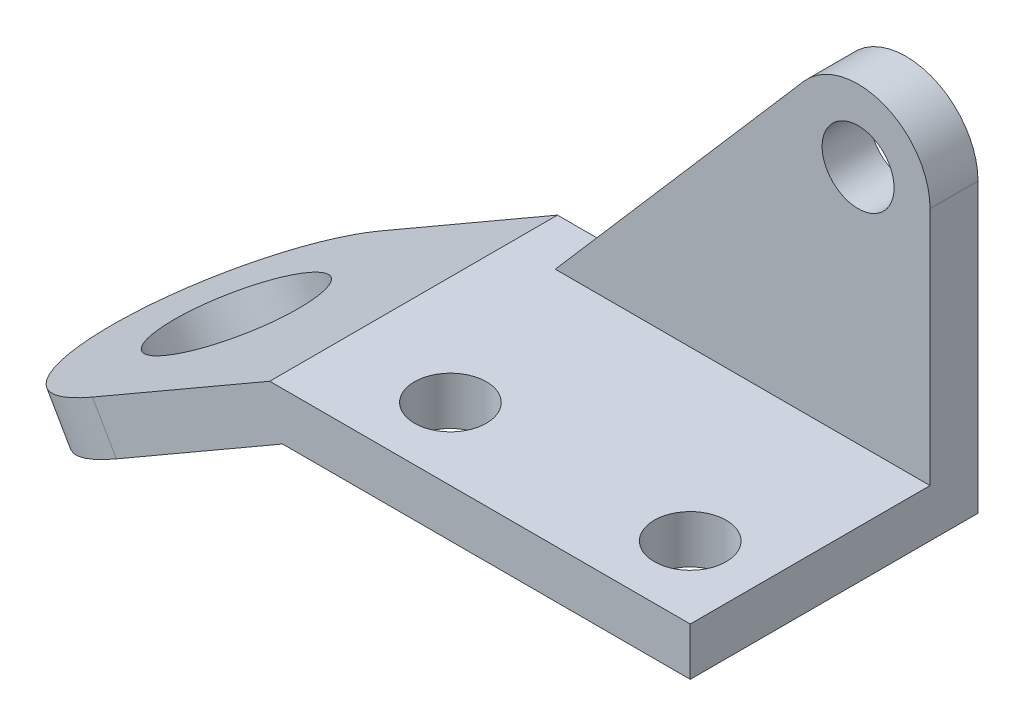
ISO-10303-21;
HEADER;
FILE_DESCRIPTION(('STEP AP214'),'2;1');
FILE_NAME('part.step','',(''),(''),'','','');
FILE_SCHEMA(('AUTOMOTIVE_DESIGN { 1 0 10303 214 1 1 1 1 }'));
ENDSEC;
DATA;
#1=APPLICATION_CONTEXT('core data for automotive mechanical design processes');
#2=APPLICATION_PROTOCOL_DEFINITION('international standard','automotive_design',2000,#1);
#3=PRODUCT_CONTEXT('',#1,'mechanical');
#4=PRODUCT('Part','Part','',(#3));
#5=PRODUCT_RELATED_PRODUCT_CATEGORY('part','',(#4));
#6=PRODUCT_DEFINITION_FORMATION('','',#4);
#7=PRODUCT_DEFINITION_CONTEXT('part definition',#1,'design');
#8=PRODUCT_DEFINITION('design','',#6,#7);
#9=PRODUCT_DEFINITION_SHAPE('','',#8);
#10=(LENGTH_UNIT() NAMED_UNIT(*) SI_UNIT(.MILLI.,.METRE.));
#11=(NAMED_UNIT(*) PLANE_ANGLE_UNIT() SI_UNIT($,.RADIAN.));
#12=(NAMED_UNIT(*) SI_UNIT($,.STERADIAN.) SOLID_ANGLE_UNIT());
#13=UNCERTAINTY_MEASURE_WITH_UNIT(LENGTH_MEASURE(1.E-05),#10,'distance_accuracy_value','');
#14=(GEOMETRIC_REPRESENTATION_CONTEXT(3) GLOBAL_UNCERTAINTY_ASSIGNED_CONTEXT((#13)) GLOBAL_UNIT_ASSIGNED_CONTEXT((#10,
#11,#12)) REPRESENTATION_CONTEXT('',''));
#15=CARTESIAN_POINT('',(0.,0.,0.));
#16=DIRECTION('',(0.,0.,1.));
#17=DIRECTION('',(1.,0.,0.));
#18=AXIS2_PLACEMENT_3D('',#15,#16,#17);
#19=CARTESIAN_POINT('',(-34.6410161513774,-20.0000000000003,30.));
#20=DIRECTION('',(0.500000000000008,-0.866025403784434,0.));
#21=DIRECTION('',(0.866025403784434,0.500000000000008,0.));
#22=AXIS2_PLACEMENT_3D('',#19,#20,#21);
#23=CYLINDRICAL_SURFACE('',#22,30.);
#24=DIRECTION('',(0.500000000000008,-0.866025403784434,0.));
#25=VECTOR('',#24,1.);
#26=CARTESIAN_POINT('',(-34.6410161513774,-20.0000000000003,0.));
#27=LINE('',#26,#25);
#28=CARTESIAN_POINT('',(-34.6410161513774,-20.0000000000003,0.));
#29=VERTEX_POINT('',#28);
#30=CARTESIAN_POINT('',(-39.6410161513775,-11.339745962156,0.));
#31=VERTEX_POINT('',#30);
#32=EDGE_CURVE('E215',#29,#31,#27,.F.);
#33=ORIENTED_EDGE('',*,*,#32,.F.);
#34=CARTESIAN_POINT('',(-34.6410161513774,-20.0000000000003,30.));
#35=DIRECTION('',(0.500000000000007,-0.866025403784434,0.));
#36=DIRECTION('',(0.866025403784435,0.500000000000007,0.));
#37=AXIS2_PLACEMENT_3D('',#34,#35,#36);
#38=CIRCLE('',#37,30.);
#39=CARTESIAN_POINT('',(-34.6410161513774,-20.0000000000003,60.));
#40=VERTEX_POINT('',#39);
#41=EDGE_CURVE('E48',#40,#29,#38,.T.);
#42=ORIENTED_EDGE('',*,*,#41,.F.);
#43=DIRECTION('',(-0.500000000000008,0.866025403784434,0.));
#44=VECTOR('',#43,1.);
#45=CARTESIAN_POINT('',(-34.6410161513774,-20.0000000000003,60.));
#46=LINE('',#45,#44);
#47=CARTESIAN_POINT('',(-39.6410161513775,-11.339745962156,60.));
#48=VERTEX_POINT('',#47);
#49=EDGE_CURVE('E219',#48,#40,#46,.F.);
#50=ORIENTED_EDGE('',*,*,#49,.F.);
#51=CARTESIAN_POINT('',(-39.6410161513775,-11.339745962156,30.));
#52=DIRECTION('',(0.500000000000007,-0.866025403784434,0.));
#53=DIRECTION('',(0.866025403784435,0.500000000000007,0.));
#54=AXIS2_PLACEMENT_3D('',#51,#52,#53);
#55=CIRCLE('',#54,30.);
#56=EDGE_CURVE('E11',#31,#48,#55,.F.);
#57=ORIENTED_EDGE('',*,*,#56,.F.);
#58=EDGE_LOOP('',(#33,#42,#50,#57));
#59=FACE_BOUND('',#58,.T.);
#60=ADVANCED_FACE('F38',(#59),#23,.T.);
#61=CARTESIAN_POINT('',(0.,0.,60.));
#62=DIRECTION('',(0.,1.,0.));
#63=DIRECTION('',(0.,0.,1.));
#64=AXIS2_PLACEMENT_3D('',#61,#62,#63);
#65=PLANE('',#64);
#66=CARTESIAN_POINT('',(20.,0.,45.));
#67=DIRECTION('',(0.,1.,0.));
#68=DIRECTION('',(0.,0.,1.));
#69=AXIS2_PLACEMENT_3D('',#66,#67,#68);
#70=CIRCLE('',#69,7.5);
#71=CARTESIAN_POINT('',(20.,0.,52.5));
#72=VERTEX_POINT('',#71);
#73=EDGE_CURVE('E157',#72,#72,#70,.T.);
#74=ORIENTED_EDGE('',*,*,#73,.T.);
#75=EDGE_LOOP('',(#74));
#76=FACE_BOUND('',#75,.T.);
#77=CARTESIAN_POINT('',(70.,0.,45.));
#78=DIRECTION('',(0.,1.,0.));
#79=DIRECTION('',(0.,0.,1.));
#80=AXIS2_PLACEMENT_3D('',#77,#78,#79);
#81=CIRCLE('',#80,7.50000000000001);
#82=CARTESIAN_POINT('',(70.,0.,52.5));
#83=VERTEX_POINT('',#82);
#84=EDGE_CURVE('E431',#83,#83,#81,.T.);
#85=ORIENTED_EDGE('',*,*,#84,.T.);
#86=EDGE_LOOP('',(#85));
#87=FACE_BOUND('',#86,.T.);
#88=DIRECTION('',(1.,0.,0.));
#89=VECTOR('',#88,1.);
#90=CARTESIAN_POINT('',(0.,0.,0.));
#91=LINE('',#90,#89);
#92=CARTESIAN_POINT('',(0.,0.,0.));
#93=VERTEX_POINT('',#92);
#94=CARTESIAN_POINT('',(85.,0.,0.));
#95=VERTEX_POINT('',#94);
#96=EDGE_CURVE('E122',#93,#95,#91,.T.);
#97=ORIENTED_EDGE('',*,*,#96,.T.);
#98=DIRECTION('',(0.,0.,-1.));
#99=VECTOR('',#98,1.);
#100=CARTESIAN_POINT('',(85.,0.,60.));
#101=LINE('',#100,#99);
#102=CARTESIAN_POINT('',(85.,0.,60.));
#103=VERTEX_POINT('',#102);
#104=EDGE_CURVE('E212',#103,#95,#101,.T.);
#105=ORIENTED_EDGE('',*,*,#104,.F.);
#106=DIRECTION('',(1.,0.,0.));
#107=VECTOR('',#106,1.);
#108=CARTESIAN_POINT('',(0.,0.,60.));
#109=LINE('',#108,#107);
#110=CARTESIAN_POINT('',(0.,0.,60.));
#111=VERTEX_POINT('',#110);
#112=EDGE_CURVE('E168',#111,#103,#109,.T.);
#113=ORIENTED_EDGE('',*,*,#112,.F.);
#114=DIRECTION('',(0.,0.,-1.));
#115=VECTOR('',#114,1.);
#116=CARTESIAN_POINT('',(0.,0.,60.));
#117=LINE('',#116,#115);
#118=EDGE_CURVE('E188',#111,#93,#117,.T.);
#119=ORIENTED_EDGE('',*,*,#118,.T.);
#120=EDGE_LOOP('',(#97,#105,#113,#119));
#121=FACE_BOUND('',#120,.T.);
#122=ADVANCED_FACE('F235',(#76,#87,#121),#65,.F.);
#123=CARTESIAN_POINT('',(85.,0.,60.));
#124=DIRECTION('',(-1.,0.,0.));
#125=DIRECTION('',(0.,0.,1.));
#126=AXIS2_PLACEMENT_3D('',#123,#124,#125);
#127=PLANE('',#126);
#128=DIRECTION('',(0.,1.,0.));
#129=VECTOR('',#128,1.);
#130=CARTESIAN_POINT('',(85.,0.,0.));
#131=LINE('',#130,#129);
#132=CARTESIAN_POINT('',(85.,60.,0.));
#133=VERTEX_POINT('',#132);
#134=EDGE_CURVE('E117',#95,#133,#131,.T.);
#135=ORIENTED_EDGE('',*,*,#134,.T.);
#136=DIRECTION('',(0.,0.,-1.));
#137=VECTOR('',#136,1.);
#138=CARTESIAN_POINT('',(85.,60.,10.));
#139=LINE('',#138,#137);
#140=CARTESIAN_POINT('',(85.,60.,10.));
#141=VERTEX_POINT('',#140);
#142=EDGE_CURVE('E109',#141,#133,#139,.T.);
#143=ORIENTED_EDGE('',*,*,#142,.F.);
#144=DIRECTION('',(0.,-1.,0.));
#145=VECTOR('',#144,1.);
#146=CARTESIAN_POINT('',(85.,0.,10.));
#147=LINE('',#146,#145);
#148=CARTESIAN_POINT('',(85.,10.,10.));
#149=VERTEX_POINT('',#148);
#150=EDGE_CURVE('E114',#141,#149,#147,.T.);
#151=ORIENTED_EDGE('',*,*,#150,.T.);
#152=DIRECTION('',(0.,0.,-1.));
#153=VECTOR('',#152,1.);
#154=CARTESIAN_POINT('',(85.,10.,60.));
#155=LINE('',#154,#153);
#156=CARTESIAN_POINT('',(85.,10.,60.));
#157=VERTEX_POINT('',#156);
#158=EDGE_CURVE('E209',#157,#149,#155,.T.);
#159=ORIENTED_EDGE('',*,*,#158,.F.);
#160=DIRECTION('',(0.,1.,0.));
#161=VECTOR('',#160,1.);
#162=CARTESIAN_POINT('',(85.,0.,60.));
#163=LINE('',#162,#161);
#164=EDGE_CURVE('E172',#103,#157,#163,.T.);
#165=ORIENTED_EDGE('',*,*,#164,.F.);
#166=ORIENTED_EDGE('',*,*,#104,.T.);
#167=EDGE_LOOP('',(#135,#143,#151,#159,#165,#166));
#168=FACE_BOUND('',#167,.T.);
#169=ADVANCED_FACE('F111',(#168),#127,.F.);
#170=CARTESIAN_POINT('',(0.,10.,60.));
#171=DIRECTION('',(0.,1.,0.));
#172=DIRECTION('',(0.,0.,1.));
#173=AXIS2_PLACEMENT_3D('',#170,#171,#172);
#174=PLANE('',#173);
#175=CARTESIAN_POINT('',(20.,10.,45.));
#176=DIRECTION('',(0.,1.,0.));
#177=DIRECTION('',(0.,0.,1.));
#178=AXIS2_PLACEMENT_3D('',#175,#176,#177);
#179=CIRCLE('',#178,7.5);
#180=CARTESIAN_POINT('',(20.,10.,52.5));
#181=VERTEX_POINT('',#180);
#182=EDGE_CURVE('E427',#181,#181,#179,.T.);
#183=ORIENTED_EDGE('',*,*,#182,.F.);
#184=EDGE_LOOP('',(#183));
#185=FACE_BOUND('',#184,.T.);
#186=CARTESIAN_POINT('',(70.,10.,45.));
#187=DIRECTION('',(0.,1.,0.));
#188=DIRECTION('',(0.,0.,1.));
#189=AXIS2_PLACEMENT_3D('',#186,#187,#188);
#190=CIRCLE('',#189,7.50000000000001);
#191=CARTESIAN_POINT('',(70.,10.,52.5));
#192=VERTEX_POINT('',#191);
#193=EDGE_CURVE('E425',#192,#192,#190,.T.);
#194=ORIENTED_EDGE('',*,*,#193,.F.);
#195=EDGE_LOOP('',(#194));
#196=FACE_BOUND('',#195,.T.);
#197=DIRECTION('',(1.,0.,0.));
#198=VECTOR('',#197,1.);
#199=CARTESIAN_POINT('',(0.,10.,10.));
#200=LINE('',#199,#198);
#201=CARTESIAN_POINT('',(6.86406460296099,10.,10.));
#202=VERTEX_POINT('',#201);
#203=EDGE_CURVE('E136',#202,#149,#200,.T.);
#204=ORIENTED_EDGE('',*,*,#203,.F.);
#205=DIRECTION('',(0.,0.,-1.));
#206=VECTOR('',#205,1.);
#207=CARTESIAN_POINT('',(6.86406460296099,10.,10.));
#208=LINE('',#207,#206);
#209=CARTESIAN_POINT('',(6.86406460296099,10.,0.));
#210=VERTEX_POINT('',#209);
#211=EDGE_CURVE('E151',#202,#210,#208,.T.);
#212=ORIENTED_EDGE('',*,*,#211,.T.);
#213=DIRECTION('',(1.,0.,0.));
#214=VECTOR('',#213,1.);
#215=CARTESIAN_POINT('',(0.,10.,0.));
#216=LINE('',#215,#214);
#217=CARTESIAN_POINT('',(-2.67949192431127,10.,0.));
#218=VERTEX_POINT('',#217);
#219=EDGE_CURVE('E194',#218,#210,#216,.T.);
#220=ORIENTED_EDGE('',*,*,#219,.F.);
#221=DIRECTION('',(0.,0.,-1.));
#222=VECTOR('',#221,1.);
#223=CARTESIAN_POINT('',(-2.67949192431127,10.,60.));
#224=LINE('',#223,#222);
#225=CARTESIAN_POINT('',(-2.67949192431127,10.,60.));
#226=VERTEX_POINT('',#225);
#227=EDGE_CURVE('E206',#226,#218,#224,.T.);
#228=ORIENTED_EDGE('',*,*,#227,.F.);
#229=DIRECTION('',(1.,0.,0.));
#230=VECTOR('',#229,1.);
#231=CARTESIAN_POINT('',(0.,10.,60.));
#232=LINE('',#231,#230);
#233=EDGE_CURVE('E176',#226,#157,#232,.T.);
#234=ORIENTED_EDGE('',*,*,#233,.T.);
#235=ORIENTED_EDGE('',*,*,#158,.T.);
#236=EDGE_LOOP('',(#204,#212,#220,#228,#234,#235));
#237=FACE_BOUND('',#236,.T.);
#238=ADVANCED_FACE('F243',(#185,#196,#237),#174,.T.);
#239=CARTESIAN_POINT('',(-5.00000000000007,8.66025403784434,60.));
#240=DIRECTION('',(0.500000000000007,-0.866025403784434,0.));
#241=DIRECTION('',(0.866025403784435,0.500000000000007,0.));
#242=AXIS2_PLACEMENT_3D('',#239,#240,#241);
#243=PLANE('',#242);
#244=CARTESIAN_POINT('',(-39.6410161513775,-11.339745962156,30.));
#245=DIRECTION('',(-0.500000000000007,0.866025403784434,0.));
#246=DIRECTION('',(-0.866025403784434,-0.500000000000007,0.));
#247=AXIS2_PLACEMENT_3D('',#244,#245,#246);
#248=CIRCLE('',#247,15.);
#249=CARTESIAN_POINT('',(-52.631397208144,-18.8397459621561,30.));
#250=VERTEX_POINT('',#249);
#251=EDGE_CURVE('E420',#250,#250,#248,.T.);
#252=ORIENTED_EDGE('',*,*,#251,.F.);
#253=EDGE_LOOP('',(#252));
#254=FACE_BOUND('',#253,.T.);
#255=DIRECTION('',(-0.866025403784434,-0.500000000000007,0.));
#256=VECTOR('',#255,1.);
#257=CARTESIAN_POINT('',(-5.00000000000007,8.66025403784434,0.));
#258=LINE('',#257,#256);
#259=EDGE_CURVE('E198',#218,#31,#258,.T.);
#260=ORIENTED_EDGE('',*,*,#259,.T.);
#261=ORIENTED_EDGE('',*,*,#56,.T.);
#262=DIRECTION('',(-0.866025403784434,-0.500000000000007,0.));
#263=VECTOR('',#262,1.);
#264=CARTESIAN_POINT('',(-5.00000000000007,8.66025403784434,60.));
#265=LINE('',#264,#263);
#266=EDGE_CURVE('E180',#226,#48,#265,.T.);
#267=ORIENTED_EDGE('',*,*,#266,.F.);
#268=ORIENTED_EDGE('',*,*,#227,.T.);
#269=EDGE_LOOP('',(#260,#261,#267,#268));
#270=FACE_BOUND('',#269,.T.);
#271=ADVANCED_FACE('F240',(#254,#270),#243,.F.);
#272=CARTESIAN_POINT('',(0.,0.,60.));
#273=DIRECTION('',(0.500000000000007,-0.866025403784434,0.));
#274=DIRECTION('',(0.866025403784435,0.500000000000007,0.));
#275=AXIS2_PLACEMENT_3D('',#272,#273,#274);
#276=PLANE('',#275);
#277=CARTESIAN_POINT('',(-34.6410161513774,-20.0000000000003,30.));
#278=DIRECTION('',(0.500000000000007,-0.866025403784434,0.));
#279=DIRECTION('',(0.866025403784435,0.500000000000007,0.));
#280=AXIS2_PLACEMENT_3D('',#277,#278,#279);
#281=CIRCLE('',#280,15.);
#282=CARTESIAN_POINT('',(-21.6506350946109,-12.5000000000002,30.));
#283=VERTEX_POINT('',#282);
#284=EDGE_CURVE('E42',#283,#283,#281,.T.);
#285=ORIENTED_EDGE('',*,*,#284,.F.);
#286=EDGE_LOOP('',(#285));
#287=FACE_BOUND('',#286,.T.);
#288=DIRECTION('',(-0.866025403784434,-0.500000000000007,0.));
#289=VECTOR('',#288,1.);
#290=CARTESIAN_POINT('',(0.,0.,60.));
#291=LINE('',#290,#289);
#292=EDGE_CURVE('E184',#111,#40,#291,.T.);
#293=ORIENTED_EDGE('',*,*,#292,.T.);
#294=ORIENTED_EDGE('',*,*,#41,.T.);
#295=DIRECTION('',(-0.866025403784434,-0.500000000000007,0.));
#296=VECTOR('',#295,1.);
#297=CARTESIAN_POINT('',(0.,0.,0.));
#298=LINE('',#297,#296);
#299=EDGE_CURVE('E173',#93,#29,#298,.T.);
#300=ORIENTED_EDGE('',*,*,#299,.F.);
#301=ORIENTED_EDGE('',*,*,#118,.F.);
#302=EDGE_LOOP('',(#293,#294,#300,#301));
#303=FACE_BOUND('',#302,.T.);
#304=ADVANCED_FACE('F226',(#287,#303),#276,.T.);
#305=CARTESIAN_POINT('',(0.,0.,60.));
#306=DIRECTION('',(0.,0.,1.));
#307=DIRECTION('',(1.,0.,0.));
#308=AXIS2_PLACEMENT_3D('',#305,#306,#307);
#309=PLANE('',#308);
#310=ORIENTED_EDGE('',*,*,#266,.T.);
#311=ORIENTED_EDGE('',*,*,#49,.T.);
#312=ORIENTED_EDGE('',*,*,#292,.F.);
#313=ORIENTED_EDGE('',*,*,#112,.T.);
#314=ORIENTED_EDGE('',*,*,#164,.T.);
#315=ORIENTED_EDGE('',*,*,#233,.F.);
#316=EDGE_LOOP('',(#310,#311,#312,#313,#314,#315));
#317=FACE_BOUND('',#316,.T.);
#318=ADVANCED_FACE('F238',(#317),#309,.T.);
#319=CARTESIAN_POINT('',(0.,0.,0.));
#320=DIRECTION('',(0.,0.,1.));
#321=DIRECTION('',(1.,0.,0.));
#322=AXIS2_PLACEMENT_3D('',#319,#320,#321);
#323=PLANE('',#322);
#324=ORIENTED_EDGE('',*,*,#299,.T.);
#325=ORIENTED_EDGE('',*,*,#32,.T.);
#326=ORIENTED_EDGE('',*,*,#259,.F.);
#327=ORIENTED_EDGE('',*,*,#219,.T.);
#328=DIRECTION('',(0.654592504564416,0.755981913122321,0.));
#329=VECTOR('',#328,1.);
#330=CARTESIAN_POINT('',(-1.02572862403725,0.888161816251433,0.));
#331=LINE('',#330,#329);
#332=CARTESIAN_POINT('',(58.6602713031652,69.8188875684662,0.));
#333=VERTEX_POINT('',#332);
#334=EDGE_CURVE('E143',#210,#333,#331,.T.);
#335=ORIENTED_EDGE('',*,*,#334,.T.);
#336=CARTESIAN_POINT('',(70.,60.,0.));
#337=DIRECTION('',(0.,0.,1.));
#338=DIRECTION('',(1.,0.,0.));
#339=AXIS2_PLACEMENT_3D('',#336,#337,#338);
#340=CIRCLE('',#339,15.);
#341=EDGE_CURVE('E156',#133,#333,#340,.T.);
#342=ORIENTED_EDGE('',*,*,#341,.F.);
#343=ORIENTED_EDGE('',*,*,#134,.F.);
#344=ORIENTED_EDGE('',*,*,#96,.F.);
#345=EDGE_LOOP('',(#324,#325,#326,#327,#335,#342,#343,#344));
#346=FACE_BOUND('',#345,.T.);
#347=CARTESIAN_POINT('',(70.,60.,0.));
#348=DIRECTION('',(0.,0.,1.));
#349=DIRECTION('',(1.,0.,0.));
#350=AXIS2_PLACEMENT_3D('',#347,#348,#349);
#351=CIRCLE('',#350,7.50000000000001);
#352=CARTESIAN_POINT('',(77.5,60.,0.));
#353=VERTEX_POINT('',#352);
#354=EDGE_CURVE('E152',#353,#353,#351,.T.);
#355=ORIENTED_EDGE('',*,*,#354,.T.);
#356=EDGE_LOOP('',(#355));
#357=FACE_BOUND('',#356,.T.);
#358=ADVANCED_FACE('F231',(#346,#357),#323,.F.);
#359=CARTESIAN_POINT('',(70.,60.,10.));
#360=DIRECTION('',(0.,0.,-1.));
#361=DIRECTION('',(-1.,0.,0.));
#362=AXIS2_PLACEMENT_3D('',#359,#360,#361);
#363=CYLINDRICAL_SURFACE('',#362,15.);
#364=ORIENTED_EDGE('',*,*,#341,.T.);
#365=DIRECTION('',(0.,0.,-1.));
#366=VECTOR('',#365,1.);
#367=CARTESIAN_POINT('',(58.6602713031652,69.8188875684662,10.));
#368=LINE('',#367,#366);
#369=CARTESIAN_POINT('',(58.6602713031652,69.8188875684662,10.));
#370=VERTEX_POINT('',#369);
#371=EDGE_CURVE('E123',#370,#333,#368,.T.);
#372=ORIENTED_EDGE('',*,*,#371,.F.);
#373=CARTESIAN_POINT('',(70.,60.,10.));
#374=DIRECTION('',(0.,0.,1.));
#375=DIRECTION('',(1.,0.,0.));
#376=AXIS2_PLACEMENT_3D('',#373,#374,#375);
#377=CIRCLE('',#376,15.);
#378=EDGE_CURVE('E126',#141,#370,#377,.T.);
#379=ORIENTED_EDGE('',*,*,#378,.F.);
#380=ORIENTED_EDGE('',*,*,#142,.T.);
#381=EDGE_LOOP('',(#364,#372,#379,#380));
#382=FACE_BOUND('',#381,.T.);
#383=ADVANCED_FACE('F127',(#382),#363,.T.);
#384=CARTESIAN_POINT('',(-1.02572862403725,0.888161816251433,10.));
#385=DIRECTION('',(-0.755981913122321,0.654592504564416,0.));
#386=DIRECTION('',(-0.654592504564416,-0.755981913122321,0.));
#387=AXIS2_PLACEMENT_3D('',#384,#385,#386);
#388=PLANE('',#387);
#389=ORIENTED_EDGE('',*,*,#334,.F.);
#390=ORIENTED_EDGE('',*,*,#211,.F.);
#391=DIRECTION('',(0.654592504564416,0.755981913122321,0.));
#392=VECTOR('',#391,1.);
#393=CARTESIAN_POINT('',(-1.02572862403725,0.888161816251433,10.));
#394=LINE('',#393,#392);
#395=EDGE_CURVE('E132',#202,#370,#394,.T.);
#396=ORIENTED_EDGE('',*,*,#395,.T.);
#397=ORIENTED_EDGE('',*,*,#371,.T.);
#398=EDGE_LOOP('',(#389,#390,#396,#397));
#399=FACE_BOUND('',#398,.T.);
#400=ADVANCED_FACE('F245',(#399),#388,.T.);
#401=CARTESIAN_POINT('',(70.,60.,10.));
#402=DIRECTION('',(0.,0.,-1.));
#403=DIRECTION('',(-1.,0.,0.));
#404=AXIS2_PLACEMENT_3D('',#401,#402,#403);
#405=CYLINDRICAL_SURFACE('',#404,7.50000000000001);
#406=CARTESIAN_POINT('',(70.,60.,10.));
#407=DIRECTION('',(0.,0.,1.));
#408=DIRECTION('',(1.,0.,0.));
#409=AXIS2_PLACEMENT_3D('',#406,#407,#408);
#410=CIRCLE('',#409,7.50000000000001);
#411=CARTESIAN_POINT('',(77.5,60.,10.));
#412=VERTEX_POINT('',#411);
#413=EDGE_CURVE('E138',#412,#412,#410,.T.);
#414=ORIENTED_EDGE('',*,*,#413,.T.);
#415=EDGE_LOOP('',(#414));
#416=FACE_BOUND('',#415,.T.);
#417=ORIENTED_EDGE('',*,*,#354,.F.);
#418=EDGE_LOOP('',(#417));
#419=FACE_BOUND('',#418,.T.);
#420=ADVANCED_FACE('F247',(#416,#419),#405,.F.);
#421=CARTESIAN_POINT('',(0.,0.,10.));
#422=DIRECTION('',(0.,0.,1.));
#423=DIRECTION('',(1.,0.,0.));
#424=AXIS2_PLACEMENT_3D('',#421,#422,#423);
#425=PLANE('',#424);
#426=ORIENTED_EDGE('',*,*,#413,.F.);
#427=EDGE_LOOP('',(#426));
#428=FACE_BOUND('',#427,.T.);
#429=ORIENTED_EDGE('',*,*,#150,.F.);
#430=ORIENTED_EDGE('',*,*,#378,.T.);
#431=ORIENTED_EDGE('',*,*,#395,.F.);
#432=ORIENTED_EDGE('',*,*,#203,.T.);
#433=EDGE_LOOP('',(#429,#430,#431,#432));
#434=FACE_BOUND('',#433,.T.);
#435=ADVANCED_FACE('F134',(#428,#434),#425,.T.);
#436=CARTESIAN_POINT('',(70.,-35.0000000000005,45.));
#437=DIRECTION('',(0.,1.,0.));
#438=DIRECTION('',(0.,0.,1.));
#439=AXIS2_PLACEMENT_3D('',#436,#437,#438);
#440=CYLINDRICAL_SURFACE('',#439,7.50000000000001);
#441=ORIENTED_EDGE('',*,*,#193,.T.);
#442=EDGE_LOOP('',(#441));
#443=FACE_BOUND('',#442,.T.);
#444=ORIENTED_EDGE('',*,*,#84,.F.);
#445=EDGE_LOOP('',(#444));
#446=FACE_BOUND('',#445,.T.);
#447=ADVANCED_FACE('F313',(#443,#446),#440,.F.);
#448=CARTESIAN_POINT('',(20.,-35.0000000000005,45.));
#449=DIRECTION('',(0.,1.,0.));
#450=DIRECTION('',(0.,0.,1.));
#451=AXIS2_PLACEMENT_3D('',#448,#449,#450);
#452=CYLINDRICAL_SURFACE('',#451,7.5);
#453=ORIENTED_EDGE('',*,*,#182,.T.);
#454=EDGE_LOOP('',(#453));
#455=FACE_BOUND('',#454,.T.);
#456=ORIENTED_EDGE('',*,*,#73,.F.);
#457=EDGE_LOOP('',(#456));
#458=FACE_BOUND('',#457,.T.);
#459=ADVANCED_FACE('F323',(#455,#458),#452,.F.);
#460=CARTESIAN_POINT('',(1.76442841485126,-83.0560796608395,30.));
#461=DIRECTION('',(-0.500000000000007,0.866025403784434,0.));
#462=DIRECTION('',(-0.866025403784435,-0.500000000000007,0.));
#463=AXIS2_PLACEMENT_3D('',#460,#461,#462);
#464=CYLINDRICAL_SURFACE('',#463,15.);
#465=ORIENTED_EDGE('',*,*,#284,.T.);
#466=EDGE_LOOP('',(#465));
#467=FACE_BOUND('',#466,.T.);
#468=ORIENTED_EDGE('',*,*,#251,.T.);
#469=EDGE_LOOP('',(#468));
#470=FACE_BOUND('',#469,.T.);
#471=ADVANCED_FACE('F334',(#467,#470),#464,.F.);
#472=CLOSED_SHELL('',(#60,#122,#169,#238,#271,#304,#318,#358,#383,#400,#420,#435,#447,#459,#471));
#473=MANIFOLD_SOLID_BREP('B2',#472);
#474=ADVANCED_BREP_SHAPE_REPRESENTATION('',(#18,#473),#14);
#475=SHAPE_DEFINITION_REPRESENTATION(#9,#474);
ENDSEC;
END-ISO-10303-21;
